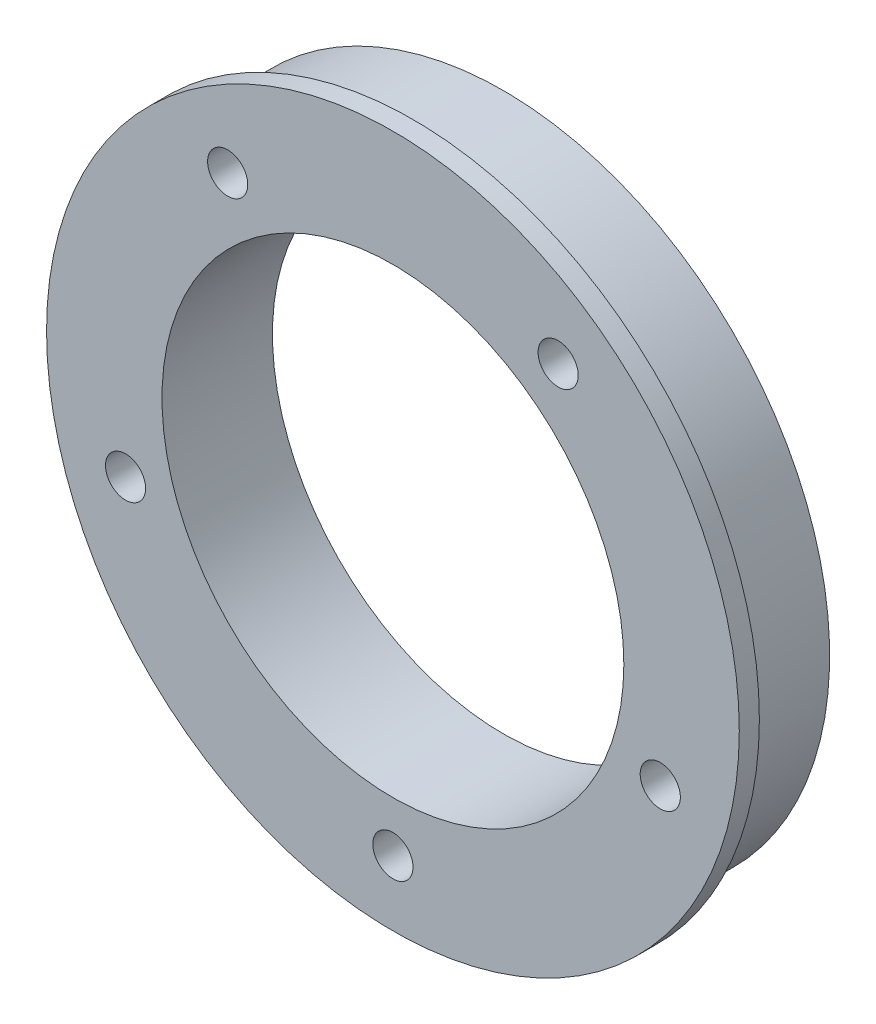
ISO-10303-21;
HEADER;
FILE_DESCRIPTION(('STEP AP214'),'2;1');
FILE_NAME('part.step','',(''),(''),'','','');
FILE_SCHEMA(('AUTOMOTIVE_DESIGN { 1 0 10303 214 1 1 1 1 }'));
ENDSEC;
DATA;
#1=APPLICATION_CONTEXT('core data for automotive mechanical design processes');
#2=APPLICATION_PROTOCOL_DEFINITION('international standard','automotive_design',2000,#1);
#3=PRODUCT_CONTEXT('',#1,'mechanical');
#4=PRODUCT('Part','Part','',(#3));
#5=PRODUCT_RELATED_PRODUCT_CATEGORY('part','',(#4));
#6=PRODUCT_DEFINITION_FORMATION('','',#4);
#7=PRODUCT_DEFINITION_CONTEXT('part definition',#1,'design');
#8=PRODUCT_DEFINITION('design','',#6,#7);
#9=PRODUCT_DEFINITION_SHAPE('','',#8);
#10=(LENGTH_UNIT() NAMED_UNIT(*) SI_UNIT(.MILLI.,.METRE.));
#11=(NAMED_UNIT(*) PLANE_ANGLE_UNIT() SI_UNIT($,.RADIAN.));
#12=(NAMED_UNIT(*) SI_UNIT($,.STERADIAN.) SOLID_ANGLE_UNIT());
#13=UNCERTAINTY_MEASURE_WITH_UNIT(LENGTH_MEASURE(1.E-05),#10,'distance_accuracy_value','');
#14=(GEOMETRIC_REPRESENTATION_CONTEXT(3) GLOBAL_UNCERTAINTY_ASSIGNED_CONTEXT((#13)) GLOBAL_UNIT_ASSIGNED_CONTEXT((#10,
#11,#12)) REPRESENTATION_CONTEXT('',''));
#15=CARTESIAN_POINT('',(0.,0.,0.));
#16=DIRECTION('',(0.,0.,1.));
#17=DIRECTION('',(1.,0.,0.));
#18=AXIS2_PLACEMENT_3D('',#15,#16,#17);
#19=CARTESIAN_POINT('',(0.,0.,0.));
#20=DIRECTION('',(0.,0.,1.));
#21=DIRECTION('',(1.,0.,0.));
#22=AXIS2_PLACEMENT_3D('',#19,#20,#21);
#23=PLANE('',#22);
#24=CARTESIAN_POINT('',(26.6295824562642,-8.65247584249883,0.));
#25=DIRECTION('',(0.,0.,1.));
#26=DIRECTION('',(1.,0.,0.));
#27=AXIS2_PLACEMENT_3D('',#24,#25,#26);
#28=CIRCLE('',#27,2.);
#29=CARTESIAN_POINT('',(28.6295824562642,-8.65247584249883,0.));
#30=VERTEX_POINT('',#29);
#31=EDGE_CURVE('E90',#30,#30,#28,.T.);
#32=ORIENTED_EDGE('',*,*,#31,.T.);
#33=EDGE_LOOP('',(#32));
#34=FACE_BOUND('',#33,.T.);
#35=CARTESIAN_POINT('',(16.4579870641894,22.6524758424984,0.));
#36=DIRECTION('',(0.,0.,1.));
#37=DIRECTION('',(1.,0.,0.));
#38=AXIS2_PLACEMENT_3D('',#35,#36,#37);
#39=CIRCLE('',#38,2.);
#40=CARTESIAN_POINT('',(18.4579870641894,22.6524758424984,0.));
#41=VERTEX_POINT('',#40);
#42=EDGE_CURVE('E82',#41,#41,#39,.T.);
#43=ORIENTED_EDGE('',*,*,#42,.T.);
#44=EDGE_LOOP('',(#43));
#45=FACE_BOUND('',#44,.T.);
#46=CARTESIAN_POINT('',(-16.4579870641891,22.6524758424986,0.));
#47=DIRECTION('',(0.,0.,1.));
#48=DIRECTION('',(1.,0.,0.));
#49=AXIS2_PLACEMENT_3D('',#46,#47,#48);
#50=CIRCLE('',#49,2.);
#51=CARTESIAN_POINT('',(-14.4579870641891,22.6524758424986,0.));
#52=VERTEX_POINT('',#51);
#53=EDGE_CURVE('E74',#52,#52,#50,.T.);
#54=ORIENTED_EDGE('',*,*,#53,.T.);
#55=EDGE_LOOP('',(#54));
#56=FACE_BOUND('',#55,.T.);
#57=CARTESIAN_POINT('',(-26.6295824562643,-8.65247584249845,0.));
#58=DIRECTION('',(0.,0.,1.));
#59=DIRECTION('',(1.,0.,0.));
#60=AXIS2_PLACEMENT_3D('',#57,#58,#59);
#61=CIRCLE('',#60,2.);
#62=CARTESIAN_POINT('',(-24.6295824562643,-8.65247584249845,0.));
#63=VERTEX_POINT('',#62);
#64=EDGE_CURVE('E66',#63,#63,#61,.T.);
#65=ORIENTED_EDGE('',*,*,#64,.T.);
#66=EDGE_LOOP('',(#65));
#67=FACE_BOUND('',#66,.T.);
#68=CARTESIAN_POINT('',(0.,-28.,0.));
#69=DIRECTION('',(0.,0.,1.));
#70=DIRECTION('',(1.,0.,0.));
#71=AXIS2_PLACEMENT_3D('',#68,#69,#70);
#72=CIRCLE('',#71,2.);
#73=CARTESIAN_POINT('',(2.,-28.,0.));
#74=VERTEX_POINT('',#73);
#75=EDGE_CURVE('E58',#74,#74,#72,.T.);
#76=ORIENTED_EDGE('',*,*,#75,.T.);
#77=EDGE_LOOP('',(#76));
#78=FACE_BOUND('',#77,.T.);
#79=CARTESIAN_POINT('',(0.,0.,0.));
#80=DIRECTION('',(0.,0.,1.));
#81=DIRECTION('',(1.,0.,0.));
#82=AXIS2_PLACEMENT_3D('',#79,#80,#81);
#83=CIRCLE('',#82,23.);
#84=CARTESIAN_POINT('',(23.,0.,0.));
#85=VERTEX_POINT('',#84);
#86=EDGE_CURVE('E50',#85,#85,#83,.T.);
#87=ORIENTED_EDGE('',*,*,#86,.T.);
#88=EDGE_LOOP('',(#87));
#89=FACE_BOUND('',#88,.T.);
#90=CARTESIAN_POINT('',(0.,0.,0.));
#91=DIRECTION('',(0.,0.,-1.));
#92=DIRECTION('',(-1.,0.,0.));
#93=AXIS2_PLACEMENT_3D('',#90,#91,#92);
#94=CIRCLE('',#93,32.5);
#95=CARTESIAN_POINT('',(-32.5,0.,0.));
#96=VERTEX_POINT('',#95);
#97=EDGE_CURVE('E102',#96,#96,#94,.T.);
#98=ORIENTED_EDGE('',*,*,#97,.T.);
#99=EDGE_LOOP('',(#98));
#100=FACE_BOUND('',#99,.T.);
#101=ADVANCED_FACE('F37',(#34,#45,#56,#67,#78,#89,#100),#23,.F.);
#102=CARTESIAN_POINT('',(0.,0.,11.));
#103=DIRECTION('',(0.,0.,-1.));
#104=DIRECTION('',(-1.,0.,0.));
#105=AXIS2_PLACEMENT_3D('',#102,#103,#104);
#106=CYLINDRICAL_SURFACE('',#105,34.5);
#107=CARTESIAN_POINT('',(0.,0.,11.));
#108=DIRECTION('',(0.,0.,1.));
#109=DIRECTION('',(1.,0.,0.));
#110=AXIS2_PLACEMENT_3D('',#107,#108,#109);
#111=CIRCLE('',#110,34.5);
#112=CARTESIAN_POINT('',(34.5,0.,11.));
#113=VERTEX_POINT('',#112);
#114=EDGE_CURVE('E10',#113,#113,#111,.T.);
#115=ORIENTED_EDGE('',*,*,#114,.F.);
#116=EDGE_LOOP('',(#115));
#117=FACE_BOUND('',#116,.T.);
#118=CARTESIAN_POINT('',(0.,0.,9.));
#119=DIRECTION('',(0.,0.,-1.));
#120=DIRECTION('',(-1.,0.,0.));
#121=AXIS2_PLACEMENT_3D('',#118,#119,#120);
#122=CIRCLE('',#121,34.5);
#123=CARTESIAN_POINT('',(-34.5,0.,9.));
#124=VERTEX_POINT('',#123);
#125=EDGE_CURVE('E94',#124,#124,#122,.T.);
#126=ORIENTED_EDGE('',*,*,#125,.F.);
#127=EDGE_LOOP('',(#126));
#128=FACE_BOUND('',#127,.T.);
#129=ADVANCED_FACE('F39',(#117,#128),#106,.T.);
#130=CARTESIAN_POINT('',(0.,0.,11.));
#131=DIRECTION('',(0.,0.,1.));
#132=DIRECTION('',(1.,0.,0.));
#133=AXIS2_PLACEMENT_3D('',#130,#131,#132);
#134=PLANE('',#133);
#135=CARTESIAN_POINT('',(16.4579870641894,22.6524758424984,11.));
#136=DIRECTION('',(0.,0.,1.));
#137=DIRECTION('',(1.,0.,0.));
#138=AXIS2_PLACEMENT_3D('',#135,#136,#137);
#139=CIRCLE('',#138,2.);
#140=CARTESIAN_POINT('',(18.4579870641894,22.6524758424984,11.));
#141=VERTEX_POINT('',#140);
#142=EDGE_CURVE('E78',#141,#141,#139,.T.);
#143=ORIENTED_EDGE('',*,*,#142,.F.);
#144=EDGE_LOOP('',(#143));
#145=FACE_BOUND('',#144,.T.);
#146=CARTESIAN_POINT('',(-26.6295824562643,-8.65247584249845,11.));
#147=DIRECTION('',(0.,0.,1.));
#148=DIRECTION('',(1.,0.,0.));
#149=AXIS2_PLACEMENT_3D('',#146,#147,#148);
#150=CIRCLE('',#149,2.);
#151=CARTESIAN_POINT('',(-24.6295824562643,-8.65247584249845,11.));
#152=VERTEX_POINT('',#151);
#153=EDGE_CURVE('E62',#152,#152,#150,.T.);
#154=ORIENTED_EDGE('',*,*,#153,.F.);
#155=EDGE_LOOP('',(#154));
#156=FACE_BOUND('',#155,.T.);
#157=CARTESIAN_POINT('',(0.,0.,11.));
#158=DIRECTION('',(0.,0.,1.));
#159=DIRECTION('',(1.,0.,0.));
#160=AXIS2_PLACEMENT_3D('',#157,#158,#159);
#161=CIRCLE('',#160,23.);
#162=CARTESIAN_POINT('',(23.,0.,11.));
#163=VERTEX_POINT('',#162);
#164=EDGE_CURVE('E45',#163,#163,#161,.T.);
#165=ORIENTED_EDGE('',*,*,#164,.F.);
#166=EDGE_LOOP('',(#165));
#167=FACE_BOUND('',#166,.T.);
#168=ORIENTED_EDGE('',*,*,#114,.T.);
#169=EDGE_LOOP('',(#168));
#170=FACE_BOUND('',#169,.T.);
#171=CARTESIAN_POINT('',(0.,-28.,11.));
#172=DIRECTION('',(0.,0.,1.));
#173=DIRECTION('',(1.,0.,0.));
#174=AXIS2_PLACEMENT_3D('',#171,#172,#173);
#175=CIRCLE('',#174,2.);
#176=CARTESIAN_POINT('',(2.,-28.,11.));
#177=VERTEX_POINT('',#176);
#178=EDGE_CURVE('E56',#177,#177,#175,.T.);
#179=ORIENTED_EDGE('',*,*,#178,.F.);
#180=EDGE_LOOP('',(#179));
#181=FACE_BOUND('',#180,.T.);
#182=CARTESIAN_POINT('',(-16.4579870641891,22.6524758424986,11.));
#183=DIRECTION('',(0.,0.,1.));
#184=DIRECTION('',(1.,0.,0.));
#185=AXIS2_PLACEMENT_3D('',#182,#183,#184);
#186=CIRCLE('',#185,2.);
#187=CARTESIAN_POINT('',(-14.4579870641891,22.6524758424986,11.));
#188=VERTEX_POINT('',#187);
#189=EDGE_CURVE('E70',#188,#188,#186,.T.);
#190=ORIENTED_EDGE('',*,*,#189,.F.);
#191=EDGE_LOOP('',(#190));
#192=FACE_BOUND('',#191,.T.);
#193=CARTESIAN_POINT('',(26.6295824562642,-8.65247584249883,11.));
#194=DIRECTION('',(0.,0.,1.));
#195=DIRECTION('',(1.,0.,0.));
#196=AXIS2_PLACEMENT_3D('',#193,#194,#195);
#197=CIRCLE('',#196,2.);
#198=CARTESIAN_POINT('',(28.6295824562642,-8.65247584249883,11.));
#199=VERTEX_POINT('',#198);
#200=EDGE_CURVE('E86',#199,#199,#197,.T.);
#201=ORIENTED_EDGE('',*,*,#200,.F.);
#202=EDGE_LOOP('',(#201));
#203=FACE_BOUND('',#202,.T.);
#204=ADVANCED_FACE('F121',(#145,#156,#167,#170,#181,#192,#203),#134,.T.);
#205=CARTESIAN_POINT('',(0.,0.,11.));
#206=DIRECTION('',(0.,0.,-1.));
#207=DIRECTION('',(-1.,0.,0.));
#208=AXIS2_PLACEMENT_3D('',#205,#206,#207);
#209=CYLINDRICAL_SURFACE('',#208,23.);
#210=ORIENTED_EDGE('',*,*,#164,.T.);
#211=EDGE_LOOP('',(#210));
#212=FACE_BOUND('',#211,.T.);
#213=ORIENTED_EDGE('',*,*,#86,.F.);
#214=EDGE_LOOP('',(#213));
#215=FACE_BOUND('',#214,.T.);
#216=ADVANCED_FACE('F127',(#212,#215),#209,.F.);
#217=CARTESIAN_POINT('',(0.,-28.,11.));
#218=DIRECTION('',(0.,0.,-1.));
#219=DIRECTION('',(-1.,0.,0.));
#220=AXIS2_PLACEMENT_3D('',#217,#218,#219);
#221=CYLINDRICAL_SURFACE('',#220,2.);
#222=ORIENTED_EDGE('',*,*,#178,.T.);
#223=EDGE_LOOP('',(#222));
#224=FACE_BOUND('',#223,.T.);
#225=ORIENTED_EDGE('',*,*,#75,.F.);
#226=EDGE_LOOP('',(#225));
#227=FACE_BOUND('',#226,.T.);
#228=ADVANCED_FACE('F137',(#224,#227),#221,.F.);
#229=CARTESIAN_POINT('',(-26.6295824562643,-8.65247584249845,11.));
#230=DIRECTION('',(0.,0.,-1.));
#231=DIRECTION('',(-1.,0.,0.));
#232=AXIS2_PLACEMENT_3D('',#229,#230,#231);
#233=CYLINDRICAL_SURFACE('',#232,2.);
#234=ORIENTED_EDGE('',*,*,#153,.T.);
#235=EDGE_LOOP('',(#234));
#236=FACE_BOUND('',#235,.T.);
#237=ORIENTED_EDGE('',*,*,#64,.F.);
#238=EDGE_LOOP('',(#237));
#239=FACE_BOUND('',#238,.T.);
#240=ADVANCED_FACE('F140',(#236,#239),#233,.F.);
#241=CARTESIAN_POINT('',(-16.4579870641891,22.6524758424986,11.));
#242=DIRECTION('',(0.,0.,-1.));
#243=DIRECTION('',(-1.,0.,0.));
#244=AXIS2_PLACEMENT_3D('',#241,#242,#243);
#245=CYLINDRICAL_SURFACE('',#244,2.);
#246=ORIENTED_EDGE('',*,*,#189,.T.);
#247=EDGE_LOOP('',(#246));
#248=FACE_BOUND('',#247,.T.);
#249=ORIENTED_EDGE('',*,*,#53,.F.);
#250=EDGE_LOOP('',(#249));
#251=FACE_BOUND('',#250,.T.);
#252=ADVANCED_FACE('F144',(#248,#251),#245,.F.);
#253=CARTESIAN_POINT('',(16.4579870641894,22.6524758424984,11.));
#254=DIRECTION('',(0.,0.,-1.));
#255=DIRECTION('',(-1.,0.,0.));
#256=AXIS2_PLACEMENT_3D('',#253,#254,#255);
#257=CYLINDRICAL_SURFACE('',#256,2.);
#258=ORIENTED_EDGE('',*,*,#142,.T.);
#259=EDGE_LOOP('',(#258));
#260=FACE_BOUND('',#259,.T.);
#261=ORIENTED_EDGE('',*,*,#42,.F.);
#262=EDGE_LOOP('',(#261));
#263=FACE_BOUND('',#262,.T.);
#264=ADVANCED_FACE('F148',(#260,#263),#257,.F.);
#265=CARTESIAN_POINT('',(26.6295824562642,-8.65247584249883,11.));
#266=DIRECTION('',(0.,0.,-1.));
#267=DIRECTION('',(-1.,0.,0.));
#268=AXIS2_PLACEMENT_3D('',#265,#266,#267);
#269=CYLINDRICAL_SURFACE('',#268,2.);
#270=ORIENTED_EDGE('',*,*,#200,.T.);
#271=EDGE_LOOP('',(#270));
#272=FACE_BOUND('',#271,.T.);
#273=ORIENTED_EDGE('',*,*,#31,.F.);
#274=EDGE_LOOP('',(#273));
#275=FACE_BOUND('',#274,.T.);
#276=ADVANCED_FACE('F116',(#272,#275),#269,.F.);
#277=CARTESIAN_POINT('',(0.,0.,9.));
#278=DIRECTION('',(0.,0.,-1.));
#279=DIRECTION('',(-1.,0.,0.));
#280=AXIS2_PLACEMENT_3D('',#277,#278,#279);
#281=PLANE('',#280);
#282=CARTESIAN_POINT('',(0.,0.,9.));
#283=DIRECTION('',(0.,0.,-1.));
#284=DIRECTION('',(-1.,0.,0.));
#285=AXIS2_PLACEMENT_3D('',#282,#283,#284);
#286=CIRCLE('',#285,32.5);
#287=CARTESIAN_POINT('',(-32.5,0.,9.));
#288=VERTEX_POINT('',#287);
#289=EDGE_CURVE('E101',#288,#288,#286,.T.);
#290=ORIENTED_EDGE('',*,*,#289,.F.);
#291=EDGE_LOOP('',(#290));
#292=FACE_BOUND('',#291,.T.);
#293=ORIENTED_EDGE('',*,*,#125,.T.);
#294=EDGE_LOOP('',(#293));
#295=FACE_BOUND('',#294,.T.);
#296=ADVANCED_FACE('F113',(#292,#295),#281,.T.);
#297=CARTESIAN_POINT('',(0.,0.,9.));
#298=DIRECTION('',(0.,0.,-1.));
#299=DIRECTION('',(-1.,0.,0.));
#300=AXIS2_PLACEMENT_3D('',#297,#298,#299);
#301=CYLINDRICAL_SURFACE('',#300,32.5);
#302=ORIENTED_EDGE('',*,*,#289,.T.);
#303=EDGE_LOOP('',(#302));
#304=FACE_BOUND('',#303,.T.);
#305=ORIENTED_EDGE('',*,*,#97,.F.);
#306=EDGE_LOOP('',(#305));
#307=FACE_BOUND('',#306,.T.);
#308=ADVANCED_FACE('F110',(#304,#307),#301,.T.);
#309=CLOSED_SHELL('',(#101,#129,#204,#216,#228,#240,#252,#264,#276,#296,#308));
#310=MANIFOLD_SOLID_BREP('B2',#309);
#311=ADVANCED_BREP_SHAPE_REPRESENTATION('',(#18,#310),#14);
#312=SHAPE_DEFINITION_REPRESENTATION(#9,#311);
ENDSEC;
END-ISO-10303-21;
